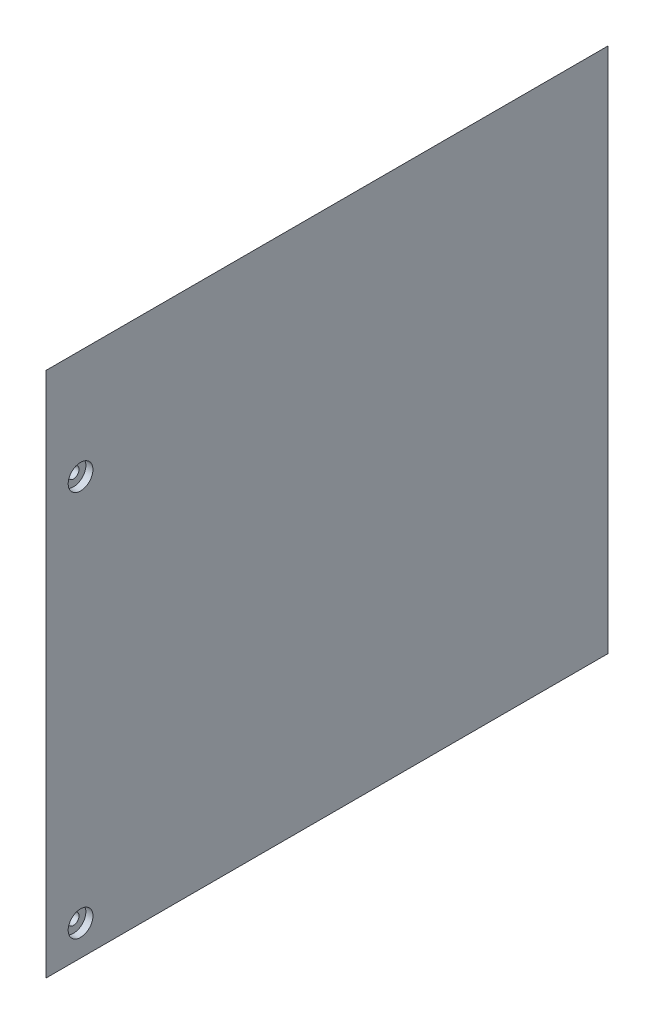
ISO-10303-21;
HEADER;
FILE_DESCRIPTION(('STEP AP214'),'2;1');
FILE_NAME('part.step','',(''),(''),'','','');
FILE_SCHEMA(('AUTOMOTIVE_DESIGN { 1 0 10303 214 1 1 1 1 }'));
ENDSEC;
DATA;
#1=APPLICATION_CONTEXT('core data for automotive mechanical design processes');
#2=APPLICATION_PROTOCOL_DEFINITION('international standard','automotive_design',2000,#1);
#3=PRODUCT_CONTEXT('',#1,'mechanical');
#4=PRODUCT('Part','Part','',(#3));
#5=PRODUCT_RELATED_PRODUCT_CATEGORY('part','',(#4));
#6=PRODUCT_DEFINITION_FORMATION('','',#4);
#7=PRODUCT_DEFINITION_CONTEXT('part definition',#1,'design');
#8=PRODUCT_DEFINITION('design','',#6,#7);
#9=PRODUCT_DEFINITION_SHAPE('','',#8);
#10=(LENGTH_UNIT() NAMED_UNIT(*) SI_UNIT(.MILLI.,.METRE.));
#11=(NAMED_UNIT(*) PLANE_ANGLE_UNIT() SI_UNIT($,.RADIAN.));
#12=(NAMED_UNIT(*) SI_UNIT($,.STERADIAN.) SOLID_ANGLE_UNIT());
#13=UNCERTAINTY_MEASURE_WITH_UNIT(LENGTH_MEASURE(1.E-05),#10,'distance_accuracy_value','');
#14=(GEOMETRIC_REPRESENTATION_CONTEXT(3) GLOBAL_UNCERTAINTY_ASSIGNED_CONTEXT((#13)) GLOBAL_UNIT_ASSIGNED_CONTEXT((#10,
#11,#12)) REPRESENTATION_CONTEXT('',''));
#15=CARTESIAN_POINT('',(0.,0.,0.));
#16=DIRECTION('',(0.,0.,1.));
#17=DIRECTION('',(1.,0.,0.));
#18=AXIS2_PLACEMENT_3D('',#15,#16,#17);
#19=CARTESIAN_POINT('',(39.,-130.,150.));
#20=DIRECTION('',(0.,1.,0.));
#21=DIRECTION('',(0.,0.,1.));
#22=AXIS2_PLACEMENT_3D('',#19,#20,#21);
#23=PLANE('',#22);
#24=DIRECTION('',(0.,0.,-1.));
#25=VECTOR('',#24,1.);
#26=CARTESIAN_POINT('',(0.,-130.,150.));
#27=LINE('',#26,#25);
#28=CARTESIAN_POINT('',(0.,-130.,88.5099999999995));
#29=VERTEX_POINT('',#28);
#30=CARTESIAN_POINT('',(0.,-130.,-111.));
#31=VERTEX_POINT('',#30);
#32=EDGE_CURVE('E91',#29,#31,#27,.T.);
#33=ORIENTED_EDGE('',*,*,#32,.T.);
#34=DIRECTION('',(-0.707106781186544,0.,0.707106781186551));
#35=VECTOR('',#34,1.);
#36=CARTESIAN_POINT('',(0.,-130.,-111.));
#37=LINE('',#36,#35);
#38=CARTESIAN_POINT('',(39.,-130.,-150.));
#39=VERTEX_POINT('',#38);
#40=EDGE_CURVE('E87',#39,#31,#37,.T.);
#41=ORIENTED_EDGE('',*,*,#40,.F.);
#42=DIRECTION('',(0.,0.,-1.));
#43=VECTOR('',#42,1.);
#44=CARTESIAN_POINT('',(39.,-130.,150.));
#45=LINE('',#44,#43);
#46=CARTESIAN_POINT('',(39.,-130.,127.51));
#47=VERTEX_POINT('',#46);
#48=EDGE_CURVE('E86',#47,#39,#45,.T.);
#49=ORIENTED_EDGE('',*,*,#48,.F.);
#50=DIRECTION('',(0.707106781186544,0.,0.707106781186551));
#51=VECTOR('',#50,1.);
#52=CARTESIAN_POINT('',(0.,-130.,88.5099999999995));
#53=LINE('',#52,#51);
#54=EDGE_CURVE('E70',#29,#47,#53,.T.);
#55=ORIENTED_EDGE('',*,*,#54,.F.);
#56=EDGE_LOOP('',(#33,#41,#49,#55));
#57=FACE_BOUND('',#56,.T.);
#58=ADVANCED_FACE('F33',(#57),#23,.F.);
#59=CARTESIAN_POINT('',(39.,0.,0.));
#60=DIRECTION('',(1.,0.,0.));
#61=DIRECTION('',(0.,0.,-1.));
#62=AXIS2_PLACEMENT_3D('',#59,#60,#61);
#63=PLANE('',#62);
#64=CARTESIAN_POINT('',(39.,-115.,110.51));
#65=DIRECTION('',(1.,0.,0.));
#66=DIRECTION('',(0.,0.,-1.));
#67=AXIS2_PLACEMENT_3D('',#64,#65,#66);
#68=CIRCLE('',#67,6.119);
#69=CARTESIAN_POINT('',(39.,-115.,104.391));
#70=VERTEX_POINT('',#69);
#71=EDGE_CURVE('E117',#70,#70,#68,.T.);
#72=ORIENTED_EDGE('',*,*,#71,.F.);
#73=EDGE_LOOP('',(#72));
#74=FACE_BOUND('',#73,.T.);
#75=CARTESIAN_POINT('',(39.,76.,110.51));
#76=DIRECTION('',(1.,0.,0.));
#77=DIRECTION('',(0.,0.,-1.));
#78=AXIS2_PLACEMENT_3D('',#75,#76,#77);
#79=CIRCLE('',#78,6.119);
#80=CARTESIAN_POINT('',(39.,76.,104.391));
#81=VERTEX_POINT('',#80);
#82=EDGE_CURVE('E113',#81,#81,#79,.T.);
#83=ORIENTED_EDGE('',*,*,#82,.F.);
#84=EDGE_LOOP('',(#83));
#85=FACE_BOUND('',#84,.T.);
#86=DIRECTION('',(0.,-1.,0.));
#87=VECTOR('',#86,1.);
#88=CARTESIAN_POINT('',(39.,202.814971674787,127.51));
#89=LINE('',#88,#87);
#90=CARTESIAN_POINT('',(39.,130.,127.51));
#91=VERTEX_POINT('',#90);
#92=EDGE_CURVE('E74',#91,#47,#89,.T.);
#93=ORIENTED_EDGE('',*,*,#92,.T.);
#94=ORIENTED_EDGE('',*,*,#48,.T.);
#95=DIRECTION('',(0.,1.,0.));
#96=VECTOR('',#95,1.);
#97=CARTESIAN_POINT('',(39.,130.,-150.));
#98=LINE('',#97,#96);
#99=CARTESIAN_POINT('',(39.,130.,-150.));
#100=VERTEX_POINT('',#99);
#101=EDGE_CURVE('E90',#39,#100,#98,.T.);
#102=ORIENTED_EDGE('',*,*,#101,.T.);
#103=DIRECTION('',(0.,0.,1.));
#104=VECTOR('',#103,1.);
#105=CARTESIAN_POINT('',(39.,130.,150.));
#106=LINE('',#105,#104);
#107=EDGE_CURVE('E41',#100,#91,#106,.T.);
#108=ORIENTED_EDGE('',*,*,#107,.T.);
#109=EDGE_LOOP('',(#93,#94,#102,#108));
#110=FACE_BOUND('',#109,.T.);
#111=ADVANCED_FACE('F84',(#74,#85,#110),#63,.T.);
#112=CARTESIAN_POINT('',(0.,0.,0.));
#113=DIRECTION('',(1.,0.,0.));
#114=DIRECTION('',(0.,0.,-1.));
#115=AXIS2_PLACEMENT_3D('',#112,#113,#114);
#116=PLANE('',#115);
#117=DIRECTION('',(0.,-1.,0.));
#118=VECTOR('',#117,1.);
#119=CARTESIAN_POINT('',(0.,202.814971674787,88.5099999999995));
#120=LINE('',#119,#118);
#121=CARTESIAN_POINT('',(0.,90.9999999999996,88.5099999999995));
#122=VERTEX_POINT('',#121);
#123=EDGE_CURVE('E76',#122,#29,#120,.T.);
#124=ORIENTED_EDGE('',*,*,#123,.F.);
#125=DIRECTION('',(0.,0.,-1.));
#126=VECTOR('',#125,1.);
#127=CARTESIAN_POINT('',(0.,90.9999999999996,234.));
#128=LINE('',#127,#126);
#129=CARTESIAN_POINT('',(0.,90.9999999999996,-111.));
#130=VERTEX_POINT('',#129);
#131=EDGE_CURVE('E101',#122,#130,#128,.T.);
#132=ORIENTED_EDGE('',*,*,#131,.T.);
#133=DIRECTION('',(0.,-1.,0.));
#134=VECTOR('',#133,1.);
#135=CARTESIAN_POINT('',(0.,202.814971674787,-111.));
#136=LINE('',#135,#134);
#137=EDGE_CURVE('E49',#130,#31,#136,.T.);
#138=ORIENTED_EDGE('',*,*,#137,.T.);
#139=ORIENTED_EDGE('',*,*,#32,.F.);
#140=EDGE_LOOP('',(#124,#132,#138,#139));
#141=FACE_BOUND('',#140,.T.);
#142=ADVANCED_FACE('F153',(#141),#116,.F.);
#143=CARTESIAN_POINT('',(0.,202.814971674787,88.5099999999995));
#144=DIRECTION('',(0.707106781186551,0.,-0.707106781186544));
#145=DIRECTION('',(-0.707106781186544,0.,-0.707106781186551));
#146=AXIS2_PLACEMENT_3D('',#143,#144,#145);
#147=PLANE('',#146);
#148=CARTESIAN_POINT('',(21.9999999999998,-115.,110.51));
#149=DIRECTION('',(0.707106781186551,0.,-0.707106781186544));
#150=DIRECTION('',(0.707106781186544,0.,0.707106781186551));
#151=AXIS2_PLACEMENT_3D('',#148,#149,#150);
#152=ELLIPSE('',#151,3.88908729652597,2.74999999999999);
#153=CARTESIAN_POINT('',(24.7499999999997,-115.,113.26));
#154=VERTEX_POINT('',#153);
#155=EDGE_CURVE('E111',#154,#154,#152,.T.);
#156=ORIENTED_EDGE('',*,*,#155,.T.);
#157=EDGE_LOOP('',(#156));
#158=FACE_BOUND('',#157,.T.);
#159=CARTESIAN_POINT('',(21.9999999999998,76.,110.51));
#160=DIRECTION('',(0.707106781186551,0.,-0.707106781186544));
#161=DIRECTION('',(0.707106781186544,0.,0.707106781186551));
#162=AXIS2_PLACEMENT_3D('',#159,#160,#161);
#163=ELLIPSE('',#162,3.88908729652598,2.75);
#164=CARTESIAN_POINT('',(24.7499999999997,76.,113.26));
#165=VERTEX_POINT('',#164);
#166=EDGE_CURVE('E107',#165,#165,#163,.T.);
#167=ORIENTED_EDGE('',*,*,#166,.T.);
#168=EDGE_LOOP('',(#167));
#169=FACE_BOUND('',#168,.T.);
#170=ORIENTED_EDGE('',*,*,#92,.F.);
#171=DIRECTION('',(-0.577350269189622,-0.577350269189628,-0.577350269189628));
#172=VECTOR('',#171,1.);
#173=CARTESIAN_POINT('',(37.271657224929,128.271657224929,125.781657224929));
#174=LINE('',#173,#172);
#175=EDGE_CURVE('E80',#91,#122,#174,.T.);
#176=ORIENTED_EDGE('',*,*,#175,.T.);
#177=ORIENTED_EDGE('',*,*,#123,.T.);
#178=ORIENTED_EDGE('',*,*,#54,.T.);
#179=EDGE_LOOP('',(#170,#176,#177,#178));
#180=FACE_BOUND('',#179,.T.);
#181=ADVANCED_FACE('F72',(#158,#169,#180),#147,.F.);
#182=CARTESIAN_POINT('',(0.,202.814971674787,-111.));
#183=DIRECTION('',(0.707106781186551,0.,0.707106781186544));
#184=DIRECTION('',(0.707106781186544,0.,-0.707106781186551));
#185=AXIS2_PLACEMENT_3D('',#182,#183,#184);
#186=PLANE('',#185);
#187=CARTESIAN_POINT('',(21.9999999999998,-115.,-133.));
#188=DIRECTION('',(0.707106781186551,0.,0.707106781186544));
#189=DIRECTION('',(-0.707106781186544,0.,0.707106781186551));
#190=AXIS2_PLACEMENT_3D('',#187,#188,#189);
#191=ELLIPSE('',#190,4.24264068711925,2.99999999999999);
#192=CARTESIAN_POINT('',(18.9999999999998,-115.,-130.));
#193=VERTEX_POINT('',#192);
#194=EDGE_CURVE('E103',#193,#193,#191,.T.);
#195=ORIENTED_EDGE('',*,*,#194,.T.);
#196=EDGE_LOOP('',(#195));
#197=FACE_BOUND('',#196,.T.);
#198=CARTESIAN_POINT('',(21.9999999999998,76.,-133.));
#199=DIRECTION('',(0.707106781186551,0.,0.707106781186544));
#200=DIRECTION('',(-0.707106781186544,0.,0.707106781186551));
#201=AXIS2_PLACEMENT_3D('',#198,#199,#200);
#202=ELLIPSE('',#201,4.24264068711925,2.99999999999999);
#203=CARTESIAN_POINT('',(18.9999999999998,76.,-130.));
#204=VERTEX_POINT('',#203);
#205=EDGE_CURVE('E98',#204,#204,#202,.T.);
#206=ORIENTED_EDGE('',*,*,#205,.T.);
#207=EDGE_LOOP('',(#206));
#208=FACE_BOUND('',#207,.T.);
#209=ORIENTED_EDGE('',*,*,#137,.F.);
#210=DIRECTION('',(0.577350269189622,0.577350269189628,-0.577350269189628));
#211=VECTOR('',#210,1.);
#212=CARTESIAN_POINT('',(37.271657224929,128.271657224929,-148.271657224929));
#213=LINE('',#212,#211);
#214=EDGE_CURVE('E11',#130,#100,#213,.T.);
#215=ORIENTED_EDGE('',*,*,#214,.T.);
#216=ORIENTED_EDGE('',*,*,#101,.F.);
#217=ORIENTED_EDGE('',*,*,#40,.T.);
#218=EDGE_LOOP('',(#209,#215,#216,#217));
#219=FACE_BOUND('',#218,.T.);
#220=ADVANCED_FACE('F151',(#197,#208,#219),#186,.F.);
#221=CARTESIAN_POINT('',(0.,90.9999999999996,234.));
#222=DIRECTION('',(0.707106781186551,-0.707106781186544,0.));
#223=DIRECTION('',(0.707106781186544,0.707106781186551,0.));
#224=AXIS2_PLACEMENT_3D('',#221,#222,#223);
#225=PLANE('',#224);
#226=CARTESIAN_POINT('',(25.,116.,95.51));
#227=DIRECTION('',(0.707106781186551,-0.707106781186544,0.));
#228=DIRECTION('',(0.707106781186544,0.707106781186551,0.));
#229=AXIS2_PLACEMENT_3D('',#226,#227,#228);
#230=ELLIPSE('',#229,4.24264068711929,2.99999999999999);
#231=CARTESIAN_POINT('',(28.,119.,95.51));
#232=VERTEX_POINT('',#231);
#233=EDGE_CURVE('E36',#232,#232,#230,.T.);
#234=ORIENTED_EDGE('',*,*,#233,.T.);
#235=EDGE_LOOP('',(#234));
#236=FACE_BOUND('',#235,.T.);
#237=CARTESIAN_POINT('',(25.,116.,-118.));
#238=DIRECTION('',(0.707106781186551,-0.707106781186544,0.));
#239=DIRECTION('',(0.707106781186544,0.707106781186551,0.));
#240=AXIS2_PLACEMENT_3D('',#237,#238,#239);
#241=ELLIPSE('',#240,4.24264068711929,2.99999999999999);
#242=CARTESIAN_POINT('',(28.,119.,-118.));
#243=VERTEX_POINT('',#242);
#244=EDGE_CURVE('E115',#243,#243,#241,.T.);
#245=ORIENTED_EDGE('',*,*,#244,.T.);
#246=EDGE_LOOP('',(#245));
#247=FACE_BOUND('',#246,.T.);
#248=ORIENTED_EDGE('',*,*,#107,.F.);
#249=ORIENTED_EDGE('',*,*,#214,.F.);
#250=ORIENTED_EDGE('',*,*,#131,.F.);
#251=ORIENTED_EDGE('',*,*,#175,.F.);
#252=EDGE_LOOP('',(#248,#249,#250,#251));
#253=FACE_BOUND('',#252,.T.);
#254=ADVANCED_FACE('F163',(#236,#247,#253),#225,.F.);
#255=CARTESIAN_POINT('',(0.,76.,-133.));
#256=DIRECTION('',(-1.,0.,0.));
#257=DIRECTION('',(0.,0.,1.));
#258=AXIS2_PLACEMENT_3D('',#255,#256,#257);
#259=CYLINDRICAL_SURFACE('',#258,2.99999999999999);
#260=CARTESIAN_POINT('',(30.,76.,-133.));
#261=DIRECTION('',(-1.,0.,0.));
#262=DIRECTION('',(0.,0.,1.));
#263=AXIS2_PLACEMENT_3D('',#260,#261,#262);
#264=CIRCLE('',#263,2.99999999999999);
#265=CARTESIAN_POINT('',(30.,76.,-130.));
#266=VERTEX_POINT('',#265);
#267=EDGE_CURVE('E102',#266,#266,#264,.T.);
#268=ORIENTED_EDGE('',*,*,#267,.F.);
#269=EDGE_LOOP('',(#268));
#270=FACE_BOUND('',#269,.T.);
#271=ORIENTED_EDGE('',*,*,#205,.F.);
#272=EDGE_LOOP('',(#271));
#273=FACE_BOUND('',#272,.T.);
#274=ADVANCED_FACE('F165',(#270,#273),#259,.F.);
#275=CARTESIAN_POINT('',(30.,76.,-133.));
#276=DIRECTION('',(-1.,0.,0.));
#277=DIRECTION('',(0.,0.,1.));
#278=AXIS2_PLACEMENT_3D('',#275,#276,#277);
#279=CONICAL_SURFACE('',#278,2.99999999999999,1.02974425867665);
#280=CARTESIAN_POINT('',(31.8025818570827,76.,-133.));
#281=VERTEX_POINT('',#280);
#282=VERTEX_LOOP('',#281);
#283=FACE_BOUND('',#282,.T.);
#284=ORIENTED_EDGE('',*,*,#267,.T.);
#285=EDGE_LOOP('',(#284));
#286=FACE_BOUND('',#285,.T.);
#287=ADVANCED_FACE('F172',(#283,#286),#279,.F.);
#288=CARTESIAN_POINT('',(0.,-115.,-133.));
#289=DIRECTION('',(-1.,0.,0.));
#290=DIRECTION('',(0.,0.,1.));
#291=AXIS2_PLACEMENT_3D('',#288,#289,#290);
#292=CYLINDRICAL_SURFACE('',#291,2.99999999999999);
#293=CARTESIAN_POINT('',(30.,-115.,-133.));
#294=DIRECTION('',(-1.,0.,0.));
#295=DIRECTION('',(0.,0.,1.));
#296=AXIS2_PLACEMENT_3D('',#293,#294,#295);
#297=CIRCLE('',#296,2.99999999999999);
#298=CARTESIAN_POINT('',(30.,-115.,-130.));
#299=VERTEX_POINT('',#298);
#300=EDGE_CURVE('E106',#299,#299,#297,.T.);
#301=ORIENTED_EDGE('',*,*,#300,.F.);
#302=EDGE_LOOP('',(#301));
#303=FACE_BOUND('',#302,.T.);
#304=ORIENTED_EDGE('',*,*,#194,.F.);
#305=EDGE_LOOP('',(#304));
#306=FACE_BOUND('',#305,.T.);
#307=ADVANCED_FACE('F211',(#303,#306),#292,.F.);
#308=CARTESIAN_POINT('',(30.,-115.,-133.));
#309=DIRECTION('',(-1.,0.,0.));
#310=DIRECTION('',(0.,0.,1.));
#311=AXIS2_PLACEMENT_3D('',#308,#309,#310);
#312=CONICAL_SURFACE('',#311,2.99999999999999,1.02974425867665);
#313=CARTESIAN_POINT('',(31.8025818570827,-115.,-133.));
#314=VERTEX_POINT('',#313);
#315=VERTEX_LOOP('',#314);
#316=FACE_BOUND('',#315,.T.);
#317=ORIENTED_EDGE('',*,*,#300,.T.);
#318=EDGE_LOOP('',(#317));
#319=FACE_BOUND('',#318,.T.);
#320=ADVANCED_FACE('F201',(#316,#319),#312,.F.);
#321=CARTESIAN_POINT('',(39.,76.,110.51));
#322=DIRECTION('',(1.,0.,0.));
#323=DIRECTION('',(0.,0.,-1.));
#324=AXIS2_PLACEMENT_3D('',#321,#322,#323);
#325=CYLINDRICAL_SURFACE('',#324,2.75);
#326=CARTESIAN_POINT('',(35.5,76.,110.51));
#327=DIRECTION('',(1.,0.,0.));
#328=DIRECTION('',(0.,0.,-1.));
#329=AXIS2_PLACEMENT_3D('',#326,#327,#328);
#330=CIRCLE('',#329,2.75);
#331=CARTESIAN_POINT('',(35.5,76.,107.76));
#332=VERTEX_POINT('',#331);
#333=EDGE_CURVE('E110',#332,#332,#330,.T.);
#334=ORIENTED_EDGE('',*,*,#333,.T.);
#335=EDGE_LOOP('',(#334));
#336=FACE_BOUND('',#335,.T.);
#337=ORIENTED_EDGE('',*,*,#166,.F.);
#338=EDGE_LOOP('',(#337));
#339=FACE_BOUND('',#338,.T.);
#340=ADVANCED_FACE('F198',(#336,#339),#325,.F.);
#341=CARTESIAN_POINT('',(35.5,78.75,110.51));
#342=DIRECTION('',(-1.,0.,0.));
#343=DIRECTION('',(0.,0.,1.));
#344=AXIS2_PLACEMENT_3D('',#341,#342,#343);
#345=PLANE('',#344);
#346=ORIENTED_EDGE('',*,*,#333,.F.);
#347=EDGE_LOOP('',(#346));
#348=FACE_BOUND('',#347,.T.);
#349=CARTESIAN_POINT('',(35.5,76.,110.51));
#350=DIRECTION('',(1.,0.,0.));
#351=DIRECTION('',(0.,0.,-1.));
#352=AXIS2_PLACEMENT_3D('',#349,#350,#351);
#353=CIRCLE('',#352,6.119);
#354=CARTESIAN_POINT('',(35.5,76.,104.391));
#355=VERTEX_POINT('',#354);
#356=EDGE_CURVE('E138',#355,#355,#353,.T.);
#357=ORIENTED_EDGE('',*,*,#356,.T.);
#358=EDGE_LOOP('',(#357));
#359=FACE_BOUND('',#358,.T.);
#360=ADVANCED_FACE('F200',(#348,#359),#345,.F.);
#361=CARTESIAN_POINT('',(39.,76.,110.51));
#362=DIRECTION('',(1.,0.,0.));
#363=DIRECTION('',(0.,0.,-1.));
#364=AXIS2_PLACEMENT_3D('',#361,#362,#363);
#365=CYLINDRICAL_SURFACE('',#364,6.119);
#366=ORIENTED_EDGE('',*,*,#356,.F.);
#367=EDGE_LOOP('',(#366));
#368=FACE_BOUND('',#367,.T.);
#369=ORIENTED_EDGE('',*,*,#82,.T.);
#370=EDGE_LOOP('',(#369));
#371=FACE_BOUND('',#370,.T.);
#372=ADVANCED_FACE('F208',(#368,#371),#365,.F.);
#373=CARTESIAN_POINT('',(39.,-115.,110.51));
#374=DIRECTION('',(1.,0.,0.));
#375=DIRECTION('',(0.,0.,-1.));
#376=AXIS2_PLACEMENT_3D('',#373,#374,#375);
#377=CYLINDRICAL_SURFACE('',#376,2.74999999999999);
#378=CARTESIAN_POINT('',(35.5,-115.,110.51));
#379=DIRECTION('',(1.,0.,0.));
#380=DIRECTION('',(0.,0.,-1.));
#381=AXIS2_PLACEMENT_3D('',#378,#379,#380);
#382=CIRCLE('',#381,2.74999999999999);
#383=CARTESIAN_POINT('',(35.5,-115.,107.76));
#384=VERTEX_POINT('',#383);
#385=EDGE_CURVE('E114',#384,#384,#382,.T.);
#386=ORIENTED_EDGE('',*,*,#385,.T.);
#387=EDGE_LOOP('',(#386));
#388=FACE_BOUND('',#387,.T.);
#389=ORIENTED_EDGE('',*,*,#155,.F.);
#390=EDGE_LOOP('',(#389));
#391=FACE_BOUND('',#390,.T.);
#392=ADVANCED_FACE('F267',(#388,#391),#377,.F.);
#393=CARTESIAN_POINT('',(35.5,-112.25,110.51));
#394=DIRECTION('',(-1.,0.,0.));
#395=DIRECTION('',(0.,0.,1.));
#396=AXIS2_PLACEMENT_3D('',#393,#394,#395);
#397=PLANE('',#396);
#398=ORIENTED_EDGE('',*,*,#385,.F.);
#399=EDGE_LOOP('',(#398));
#400=FACE_BOUND('',#399,.T.);
#401=CARTESIAN_POINT('',(35.5,-115.,110.51));
#402=DIRECTION('',(1.,0.,0.));
#403=DIRECTION('',(0.,0.,-1.));
#404=AXIS2_PLACEMENT_3D('',#401,#402,#403);
#405=CIRCLE('',#404,6.119);
#406=CARTESIAN_POINT('',(35.5,-115.,104.391));
#407=VERTEX_POINT('',#406);
#408=EDGE_CURVE('E122',#407,#407,#405,.T.);
#409=ORIENTED_EDGE('',*,*,#408,.T.);
#410=EDGE_LOOP('',(#409));
#411=FACE_BOUND('',#410,.T.);
#412=ADVANCED_FACE('F276',(#400,#411),#397,.F.);
#413=CARTESIAN_POINT('',(39.,-115.,110.51));
#414=DIRECTION('',(1.,0.,0.));
#415=DIRECTION('',(0.,0.,-1.));
#416=AXIS2_PLACEMENT_3D('',#413,#414,#415);
#417=CYLINDRICAL_SURFACE('',#416,6.119);
#418=ORIENTED_EDGE('',*,*,#408,.F.);
#419=EDGE_LOOP('',(#418));
#420=FACE_BOUND('',#419,.T.);
#421=ORIENTED_EDGE('',*,*,#71,.T.);
#422=EDGE_LOOP('',(#421));
#423=FACE_BOUND('',#422,.T.);
#424=ADVANCED_FACE('F286',(#420,#423),#417,.F.);
#425=CARTESIAN_POINT('',(25.,130.,-118.));
#426=DIRECTION('',(0.,1.,0.));
#427=DIRECTION('',(0.,0.,1.));
#428=AXIS2_PLACEMENT_3D('',#425,#426,#427);
#429=CYLINDRICAL_SURFACE('',#428,2.99999999999999);
#430=CARTESIAN_POINT('',(25.,100.,-118.));
#431=DIRECTION('',(0.,1.,0.));
#432=DIRECTION('',(0.,0.,1.));
#433=AXIS2_PLACEMENT_3D('',#430,#431,#432);
#434=CIRCLE('',#433,2.99999999999999);
#435=CARTESIAN_POINT('',(25.,100.,-115.));
#436=VERTEX_POINT('',#435);
#437=EDGE_CURVE('E118',#436,#436,#434,.T.);
#438=ORIENTED_EDGE('',*,*,#437,.F.);
#439=EDGE_LOOP('',(#438));
#440=FACE_BOUND('',#439,.T.);
#441=ORIENTED_EDGE('',*,*,#244,.F.);
#442=EDGE_LOOP('',(#441));
#443=FACE_BOUND('',#442,.T.);
#444=ADVANCED_FACE('F295',(#440,#443),#429,.F.);
#445=CARTESIAN_POINT('',(25.,100.,-118.));
#446=DIRECTION('',(0.,1.,0.));
#447=DIRECTION('',(0.,0.,1.));
#448=AXIS2_PLACEMENT_3D('',#445,#446,#447);
#449=CONICAL_SURFACE('',#448,2.99999999999999,1.02974425867665);
#450=CARTESIAN_POINT('',(25.,98.1974181429173,-118.));
#451=VERTEX_POINT('',#450);
#452=VERTEX_LOOP('',#451);
#453=FACE_BOUND('',#452,.T.);
#454=ORIENTED_EDGE('',*,*,#437,.T.);
#455=EDGE_LOOP('',(#454));
#456=FACE_BOUND('',#455,.T.);
#457=ADVANCED_FACE('F311',(#453,#456),#449,.F.);
#458=CARTESIAN_POINT('',(25.,130.,95.51));
#459=DIRECTION('',(0.,1.,0.));
#460=DIRECTION('',(0.,0.,1.));
#461=AXIS2_PLACEMENT_3D('',#458,#459,#460);
#462=CYLINDRICAL_SURFACE('',#461,2.99999999999999);
#463=CARTESIAN_POINT('',(25.,100.,95.51));
#464=DIRECTION('',(0.,1.,0.));
#465=DIRECTION('',(0.,0.,1.));
#466=AXIS2_PLACEMENT_3D('',#463,#464,#465);
#467=CIRCLE('',#466,2.99999999999999);
#468=CARTESIAN_POINT('',(25.,100.,98.5099999999999));
#469=VERTEX_POINT('',#468);
#470=EDGE_CURVE('E129',#469,#469,#467,.T.);
#471=ORIENTED_EDGE('',*,*,#470,.F.);
#472=EDGE_LOOP('',(#471));
#473=FACE_BOUND('',#472,.T.);
#474=ORIENTED_EDGE('',*,*,#233,.F.);
#475=EDGE_LOOP('',(#474));
#476=FACE_BOUND('',#475,.T.);
#477=ADVANCED_FACE('F321',(#473,#476),#462,.F.);
#478=CARTESIAN_POINT('',(25.,100.,95.51));
#479=DIRECTION('',(0.,1.,0.));
#480=DIRECTION('',(0.,0.,1.));
#481=AXIS2_PLACEMENT_3D('',#478,#479,#480);
#482=CONICAL_SURFACE('',#481,2.99999999999999,1.02974425867665);
#483=CARTESIAN_POINT('',(25.,98.1974181429173,95.51));
#484=VERTEX_POINT('',#483);
#485=VERTEX_LOOP('',#484);
#486=FACE_BOUND('',#485,.T.);
#487=ORIENTED_EDGE('',*,*,#470,.T.);
#488=EDGE_LOOP('',(#487));
#489=FACE_BOUND('',#488,.T.);
#490=ADVANCED_FACE('F331',(#486,#489),#482,.F.);
#491=CLOSED_SHELL('',(#58,#111,#142,#181,#220,#254,#274,#287,#307,#320,#340,#360,#372,#392,#412,
#424,#444,#457,#477,#490));
#492=MANIFOLD_SOLID_BREP('B2',#491);
#493=ADVANCED_BREP_SHAPE_REPRESENTATION('',(#18,#492),#14);
#494=SHAPE_DEFINITION_REPRESENTATION(#9,#493);
ENDSEC;
END-ISO-10303-21;
